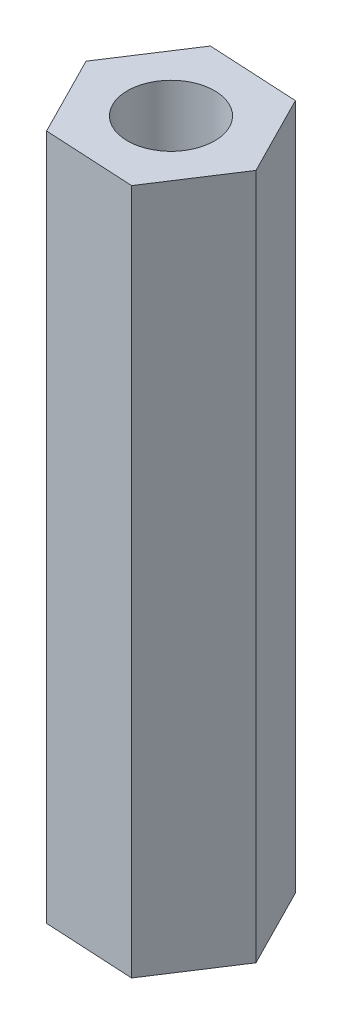
ISO-10303-21;
HEADER;
FILE_DESCRIPTION(('STEP AP214'),'2;1');
FILE_NAME('part.step','',(''),(''),'','','');
FILE_SCHEMA(('AUTOMOTIVE_DESIGN { 1 0 10303 214 1 1 1 1 }'));
ENDSEC;
DATA;
#1=APPLICATION_CONTEXT('core data for automotive mechanical design processes');
#2=APPLICATION_PROTOCOL_DEFINITION('international standard','automotive_design',2000,#1);
#3=PRODUCT_CONTEXT('',#1,'mechanical');
#4=PRODUCT('Part','Part','',(#3));
#5=PRODUCT_RELATED_PRODUCT_CATEGORY('part','',(#4));
#6=PRODUCT_DEFINITION_FORMATION('','',#4);
#7=PRODUCT_DEFINITION_CONTEXT('part definition',#1,'design');
#8=PRODUCT_DEFINITION('design','',#6,#7);
#9=PRODUCT_DEFINITION_SHAPE('','',#8);
#10=(LENGTH_UNIT() NAMED_UNIT(*) SI_UNIT(.MILLI.,.METRE.));
#11=(NAMED_UNIT(*) PLANE_ANGLE_UNIT() SI_UNIT($,.RADIAN.));
#12=(NAMED_UNIT(*) SI_UNIT($,.STERADIAN.) SOLID_ANGLE_UNIT());
#13=UNCERTAINTY_MEASURE_WITH_UNIT(LENGTH_MEASURE(1.E-05),#10,'distance_accuracy_value','');
#14=(GEOMETRIC_REPRESENTATION_CONTEXT(3) GLOBAL_UNCERTAINTY_ASSIGNED_CONTEXT((#13)) GLOBAL_UNIT_ASSIGNED_CONTEXT((#10,
#11,#12)) REPRESENTATION_CONTEXT('',''));
#15=CARTESIAN_POINT('',(0.,0.,0.));
#16=DIRECTION('',(0.,0.,1.));
#17=DIRECTION('',(1.,0.,0.));
#18=AXIS2_PLACEMENT_3D('',#15,#16,#17);
#19=CARTESIAN_POINT('',(1.54318664004275,26.,3.03675951094697));
#20=DIRECTION('',(-0.838083193513256,0.,-0.545542446332659));
#21=DIRECTION('',(-0.545542446332659,0.,0.838083193513256));
#22=AXIS2_PLACEMENT_3D('',#19,#20,#21);
#23=PLANE('',#22);
#24=DIRECTION('',(0.545542446332659,0.,-0.838083193513256));
#25=VECTOR('',#24,1.);
#26=CARTESIAN_POINT('',(1.54318664004275,0.,3.03675951094697));
#27=LINE('',#26,#25);
#28=CARTESIAN_POINT('',(1.54318664004275,0.,3.03675951094697));
#29=VERTEX_POINT('',#28);
#30=CARTESIAN_POINT('',(3.40150420168546,0.,0.181940922415713));
#31=VERTEX_POINT('',#30);
#32=EDGE_CURVE('E130',#29,#31,#27,.T.);
#33=ORIENTED_EDGE('',*,*,#32,.T.);
#34=DIRECTION('',(0.,-1.,0.));
#35=VECTOR('',#34,1.);
#36=CARTESIAN_POINT('',(3.40150420168546,26.,0.181940922415713));
#37=LINE('',#36,#35);
#38=CARTESIAN_POINT('',(3.40150420168546,26.,0.181940922415713));
#39=VERTEX_POINT('',#38);
#40=EDGE_CURVE('E11',#39,#31,#37,.T.);
#41=ORIENTED_EDGE('',*,*,#40,.F.);
#42=DIRECTION('',(0.545542446332659,0.,-0.838083193513256));
#43=VECTOR('',#42,1.);
#44=CARTESIAN_POINT('',(1.54318664004275,26.,3.03675951094697));
#45=LINE('',#44,#43);
#46=CARTESIAN_POINT('',(1.54318664004275,26.,3.03675951094697));
#47=VERTEX_POINT('',#46);
#48=EDGE_CURVE('E138',#47,#39,#45,.T.);
#49=ORIENTED_EDGE('',*,*,#48,.F.);
#50=DIRECTION('',(0.,-1.,0.));
#51=VECTOR('',#50,1.);
#52=CARTESIAN_POINT('',(1.54318664004275,26.,3.03675951094697));
#53=LINE('',#52,#51);
#54=EDGE_CURVE('E123',#47,#29,#53,.T.);
#55=ORIENTED_EDGE('',*,*,#54,.T.);
#56=EDGE_LOOP('',(#33,#41,#49,#55));
#57=FACE_BOUND('',#56,.T.);
#58=ADVANCED_FACE('F43',(#57),#23,.F.);
#59=CARTESIAN_POINT('',(3.40150420168546,26.,0.181940922415713));
#60=DIRECTION('',(-0.891495214123419,0.,0.45303011290094));
#61=DIRECTION('',(0.45303011290094,0.,0.891495214123419));
#62=AXIS2_PLACEMENT_3D('',#59,#60,#61);
#63=PLANE('',#62);
#64=DIRECTION('',(-0.45303011290094,0.,-0.891495214123419));
#65=VECTOR('',#64,1.);
#66=CARTESIAN_POINT('',(3.40150420168546,0.,0.181940922415713));
#67=LINE('',#66,#65);
#68=CARTESIAN_POINT('',(1.85831756164271,0.,-2.85481858853126));
#69=VERTEX_POINT('',#68);
#70=EDGE_CURVE('E128',#31,#69,#67,.T.);
#71=ORIENTED_EDGE('',*,*,#70,.T.);
#72=DIRECTION('',(0.,-1.,0.));
#73=VECTOR('',#72,1.);
#74=CARTESIAN_POINT('',(1.85831756164271,26.,-2.85481858853126));
#75=LINE('',#74,#73);
#76=CARTESIAN_POINT('',(1.85831756164271,26.,-2.85481858853126));
#77=VERTEX_POINT('',#76);
#78=EDGE_CURVE('E51',#77,#69,#75,.T.);
#79=ORIENTED_EDGE('',*,*,#78,.F.);
#80=DIRECTION('',(-0.45303011290094,0.,-0.891495214123419));
#81=VECTOR('',#80,1.);
#82=CARTESIAN_POINT('',(3.40150420168546,26.,0.181940922415713));
#83=LINE('',#82,#81);
#84=EDGE_CURVE('E96',#39,#77,#83,.T.);
#85=ORIENTED_EDGE('',*,*,#84,.F.);
#86=ORIENTED_EDGE('',*,*,#40,.T.);
#87=EDGE_LOOP('',(#71,#79,#85,#86));
#88=FACE_BOUND('',#87,.T.);
#89=ADVANCED_FACE('F162',(#88),#63,.F.);
#90=CARTESIAN_POINT('',(1.85831756164271,26.,-2.85481858853126));
#91=DIRECTION('',(-0.0534120206101634,0.,0.998572559233599));
#92=DIRECTION('',(0.998572559233599,0.,0.0534120206101634));
#93=AXIS2_PLACEMENT_3D('',#90,#91,#92);
#94=PLANE('',#93);
#95=DIRECTION('',(-0.998572559233599,0.,-0.0534120206101634));
#96=VECTOR('',#95,1.);
#97=CARTESIAN_POINT('',(1.85831756164271,0.,-2.85481858853126));
#98=LINE('',#97,#96);
#99=CARTESIAN_POINT('',(-1.54318664004275,0.,-3.03675951094697));
#100=VERTEX_POINT('',#99);
#101=EDGE_CURVE('E132',#69,#100,#98,.T.);
#102=ORIENTED_EDGE('',*,*,#101,.T.);
#103=DIRECTION('',(0.,-1.,0.));
#104=VECTOR('',#103,1.);
#105=CARTESIAN_POINT('',(-1.54318664004275,26.,-3.03675951094697));
#106=LINE('',#105,#104);
#107=CARTESIAN_POINT('',(-1.54318664004275,26.,-3.03675951094697));
#108=VERTEX_POINT('',#107);
#109=EDGE_CURVE('E117',#108,#100,#106,.T.);
#110=ORIENTED_EDGE('',*,*,#109,.F.);
#111=DIRECTION('',(-0.998572559233599,0.,-0.0534120206101634));
#112=VECTOR('',#111,1.);
#113=CARTESIAN_POINT('',(1.85831756164271,26.,-2.85481858853126));
#114=LINE('',#113,#112);
#115=EDGE_CURVE('E108',#77,#108,#114,.T.);
#116=ORIENTED_EDGE('',*,*,#115,.F.);
#117=ORIENTED_EDGE('',*,*,#78,.T.);
#118=EDGE_LOOP('',(#102,#110,#116,#117));
#119=FACE_BOUND('',#118,.T.);
#120=ADVANCED_FACE('F145',(#119),#94,.F.);
#121=CARTESIAN_POINT('',(-1.54318664004275,26.,-3.03675951094697));
#122=DIRECTION('',(0.838083193513256,0.,0.545542446332659));
#123=DIRECTION('',(0.545542446332659,0.,-0.838083193513256));
#124=AXIS2_PLACEMENT_3D('',#121,#122,#123);
#125=PLANE('',#124);
#126=DIRECTION('',(-0.545542446332659,0.,0.838083193513256));
#127=VECTOR('',#126,1.);
#128=CARTESIAN_POINT('',(-1.54318664004275,0.,-3.03675951094697));
#129=LINE('',#128,#127);
#130=CARTESIAN_POINT('',(-3.40150420168546,0.,-0.181940922415714));
#131=VERTEX_POINT('',#130);
#132=EDGE_CURVE('E119',#100,#131,#129,.T.);
#133=ORIENTED_EDGE('',*,*,#132,.T.);
#134=DIRECTION('',(0.,-1.,0.));
#135=VECTOR('',#134,1.);
#136=CARTESIAN_POINT('',(-3.40150420168546,26.,-0.181940922415714));
#137=LINE('',#136,#135);
#138=CARTESIAN_POINT('',(-3.40150420168546,26.,-0.181940922415714));
#139=VERTEX_POINT('',#138);
#140=EDGE_CURVE('E111',#139,#131,#137,.T.);
#141=ORIENTED_EDGE('',*,*,#140,.F.);
#142=DIRECTION('',(-0.545542446332659,0.,0.838083193513256));
#143=VECTOR('',#142,1.);
#144=CARTESIAN_POINT('',(-1.54318664004275,26.,-3.03675951094697));
#145=LINE('',#144,#143);
#146=EDGE_CURVE('E103',#108,#139,#145,.T.);
#147=ORIENTED_EDGE('',*,*,#146,.F.);
#148=ORIENTED_EDGE('',*,*,#109,.T.);
#149=EDGE_LOOP('',(#133,#141,#147,#148));
#150=FACE_BOUND('',#149,.T.);
#151=ADVANCED_FACE('F113',(#150),#125,.F.);
#152=CARTESIAN_POINT('',(-3.40150420168546,26.,-0.181940922415714));
#153=DIRECTION('',(0.891495214123419,0.,-0.45303011290094));
#154=DIRECTION('',(-0.45303011290094,0.,-0.89149521412342));
#155=AXIS2_PLACEMENT_3D('',#152,#153,#154);
#156=PLANE('',#155);
#157=DIRECTION('',(0.45303011290094,0.,0.891495214123419));
#158=VECTOR('',#157,1.);
#159=CARTESIAN_POINT('',(-3.40150420168546,0.,-0.181940922415714));
#160=LINE('',#159,#158);
#161=CARTESIAN_POINT('',(-1.85831756164271,0.,2.85481858853126));
#162=VERTEX_POINT('',#161);
#163=EDGE_CURVE('E85',#131,#162,#160,.T.);
#164=ORIENTED_EDGE('',*,*,#163,.T.);
#165=DIRECTION('',(0.,-1.,0.));
#166=VECTOR('',#165,1.);
#167=CARTESIAN_POINT('',(-1.85831756164271,26.,2.85481858853126));
#168=LINE('',#167,#166);
#169=CARTESIAN_POINT('',(-1.85831756164271,26.,2.85481858853126));
#170=VERTEX_POINT('',#169);
#171=EDGE_CURVE('E120',#170,#162,#168,.T.);
#172=ORIENTED_EDGE('',*,*,#171,.F.);
#173=DIRECTION('',(0.45303011290094,0.,0.891495214123419));
#174=VECTOR('',#173,1.);
#175=CARTESIAN_POINT('',(-3.40150420168546,26.,-0.181940922415714));
#176=LINE('',#175,#174);
#177=EDGE_CURVE('E110',#139,#170,#176,.T.);
#178=ORIENTED_EDGE('',*,*,#177,.F.);
#179=ORIENTED_EDGE('',*,*,#140,.T.);
#180=EDGE_LOOP('',(#164,#172,#178,#179));
#181=FACE_BOUND('',#180,.T.);
#182=ADVANCED_FACE('F121',(#181),#156,.F.);
#183=CARTESIAN_POINT('',(-1.85831756164271,26.,2.85481858853126));
#184=DIRECTION('',(0.0534120206101633,0.,-0.998572559233599));
#185=DIRECTION('',(-0.998572559233599,0.,-0.0534120206101634));
#186=AXIS2_PLACEMENT_3D('',#183,#184,#185);
#187=PLANE('',#186);
#188=DIRECTION('',(0.998572559233599,0.,0.0534120206101633));
#189=VECTOR('',#188,1.);
#190=CARTESIAN_POINT('',(-1.85831756164271,0.,2.85481858853126));
#191=LINE('',#190,#189);
#192=EDGE_CURVE('E86',#162,#29,#191,.T.);
#193=ORIENTED_EDGE('',*,*,#192,.T.);
#194=ORIENTED_EDGE('',*,*,#54,.F.);
#195=DIRECTION('',(0.998572559233599,0.,0.0534120206101633));
#196=VECTOR('',#195,1.);
#197=CARTESIAN_POINT('',(-1.85831756164271,26.,2.85481858853126));
#198=LINE('',#197,#196);
#199=EDGE_CURVE('E56',#170,#47,#198,.T.);
#200=ORIENTED_EDGE('',*,*,#199,.F.);
#201=ORIENTED_EDGE('',*,*,#171,.T.);
#202=EDGE_LOOP('',(#193,#194,#200,#201));
#203=FACE_BOUND('',#202,.T.);
#204=ADVANCED_FACE('F151',(#203),#187,.F.);
#205=CARTESIAN_POINT('',(0.,26.,0.));
#206=DIRECTION('',(0.,1.,0.));
#207=DIRECTION('',(0.,0.,1.));
#208=AXIS2_PLACEMENT_3D('',#205,#206,#207);
#209=PLANE('',#208);
#210=CARTESIAN_POINT('',(0.,26.,0.));
#211=DIRECTION('',(0.,1.,0.));
#212=DIRECTION('',(0.,0.,1.));
#213=AXIS2_PLACEMENT_3D('',#210,#211,#212);
#214=CIRCLE('',#213,1.64999999999999);
#215=CARTESIAN_POINT('',(0.,26.,1.64999999999999));
#216=VERTEX_POINT('',#215);
#217=EDGE_CURVE('E222',#216,#216,#214,.T.);
#218=ORIENTED_EDGE('',*,*,#217,.F.);
#219=EDGE_LOOP('',(#218));
#220=FACE_BOUND('',#219,.T.);
#221=ORIENTED_EDGE('',*,*,#48,.T.);
#222=ORIENTED_EDGE('',*,*,#84,.T.);
#223=ORIENTED_EDGE('',*,*,#115,.T.);
#224=ORIENTED_EDGE('',*,*,#146,.T.);
#225=ORIENTED_EDGE('',*,*,#177,.T.);
#226=ORIENTED_EDGE('',*,*,#199,.T.);
#227=EDGE_LOOP('',(#221,#222,#223,#224,#225,#226));
#228=FACE_BOUND('',#227,.T.);
#229=ADVANCED_FACE('F104',(#220,#228),#209,.T.);
#230=CARTESIAN_POINT('',(0.,0.,0.));
#231=DIRECTION('',(0.,1.,0.));
#232=DIRECTION('',(0.,0.,1.));
#233=AXIS2_PLACEMENT_3D('',#230,#231,#232);
#234=PLANE('',#233);
#235=CARTESIAN_POINT('',(0.,0.,0.));
#236=DIRECTION('',(0.,1.,0.));
#237=DIRECTION('',(0.,0.,1.));
#238=AXIS2_PLACEMENT_3D('',#235,#236,#237);
#239=CIRCLE('',#238,1.65);
#240=CARTESIAN_POINT('',(0.,0.,1.65));
#241=VERTEX_POINT('',#240);
#242=EDGE_CURVE('E133',#241,#241,#239,.T.);
#243=ORIENTED_EDGE('',*,*,#242,.T.);
#244=EDGE_LOOP('',(#243));
#245=FACE_BOUND('',#244,.T.);
#246=ORIENTED_EDGE('',*,*,#32,.F.);
#247=ORIENTED_EDGE('',*,*,#192,.F.);
#248=ORIENTED_EDGE('',*,*,#163,.F.);
#249=ORIENTED_EDGE('',*,*,#132,.F.);
#250=ORIENTED_EDGE('',*,*,#101,.F.);
#251=ORIENTED_EDGE('',*,*,#70,.F.);
#252=EDGE_LOOP('',(#246,#247,#248,#249,#250,#251));
#253=FACE_BOUND('',#252,.T.);
#254=ADVANCED_FACE('F150',(#245,#253),#234,.F.);
#255=CARTESIAN_POINT('',(0.,26.,0.));
#256=DIRECTION('',(0.,1.,0.));
#257=DIRECTION('',(0.,0.,1.));
#258=AXIS2_PLACEMENT_3D('',#255,#256,#257);
#259=CYLINDRICAL_SURFACE('',#258,1.64999999999999);
#260=ORIENTED_EDGE('',*,*,#242,.F.);
#261=EDGE_LOOP('',(#260));
#262=FACE_BOUND('',#261,.T.);
#263=ORIENTED_EDGE('',*,*,#217,.T.);
#264=EDGE_LOOP('',(#263));
#265=FACE_BOUND('',#264,.T.);
#266=ADVANCED_FACE('F205',(#262,#265),#259,.F.);
#267=CLOSED_SHELL('',(#58,#89,#120,#151,#182,#204,#229,#254,#266));
#268=MANIFOLD_SOLID_BREP('B2',#267);
#269=ADVANCED_BREP_SHAPE_REPRESENTATION('',(#18,#268),#14);
#270=SHAPE_DEFINITION_REPRESENTATION(#9,#269);
ENDSEC;
END-ISO-10303-21;
